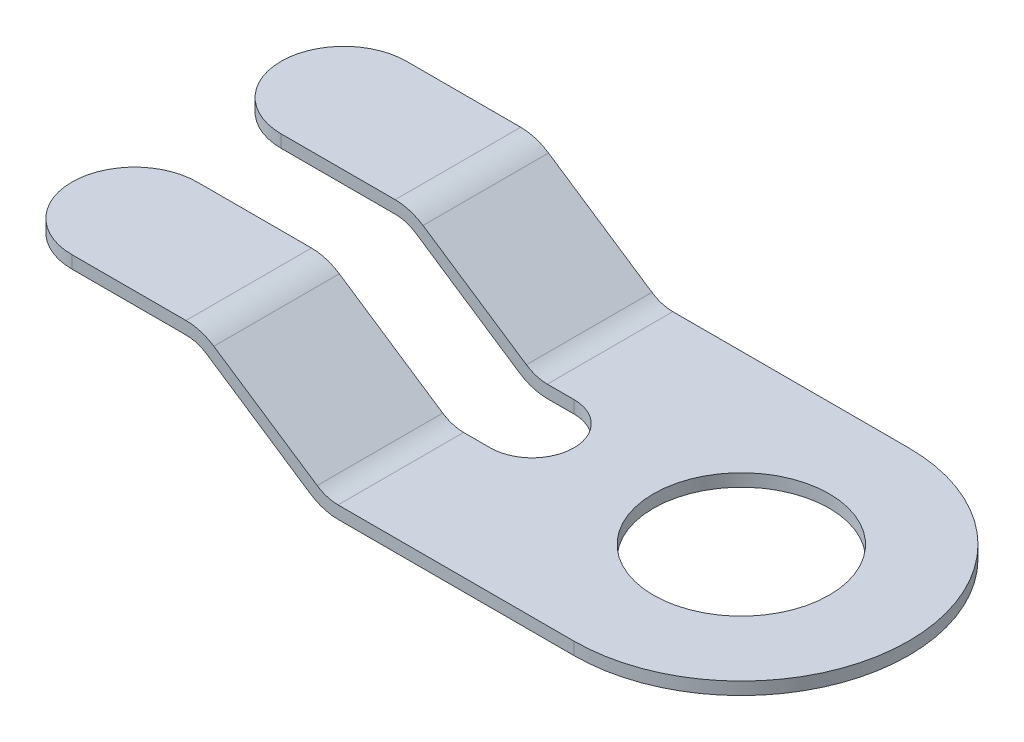
ISO-10303-21;
HEADER;
FILE_DESCRIPTION(('STEP AP214'),'2;1');
FILE_NAME('part.step','',(''),(''),'','','');
FILE_SCHEMA(('AUTOMOTIVE_DESIGN { 1 0 10303 214 1 1 1 1 }'));
ENDSEC;
DATA;
#1=APPLICATION_CONTEXT('core data for automotive mechanical design processes');
#2=APPLICATION_PROTOCOL_DEFINITION('international standard','automotive_design',2000,#1);
#3=PRODUCT_CONTEXT('',#1,'mechanical');
#4=PRODUCT('Part','Part','',(#3));
#5=PRODUCT_RELATED_PRODUCT_CATEGORY('part','',(#4));
#6=PRODUCT_DEFINITION_FORMATION('','',#4);
#7=PRODUCT_DEFINITION_CONTEXT('part definition',#1,'design');
#8=PRODUCT_DEFINITION('design','',#6,#7);
#9=PRODUCT_DEFINITION_SHAPE('','',#8);
#10=(LENGTH_UNIT() NAMED_UNIT(*) SI_UNIT(.MILLI.,.METRE.));
#11=(NAMED_UNIT(*) PLANE_ANGLE_UNIT() SI_UNIT($,.RADIAN.));
#12=(NAMED_UNIT(*) SI_UNIT($,.STERADIAN.) SOLID_ANGLE_UNIT());
#13=UNCERTAINTY_MEASURE_WITH_UNIT(LENGTH_MEASURE(1.E-05),#10,'distance_accuracy_value','');
#14=(GEOMETRIC_REPRESENTATION_CONTEXT(3) GLOBAL_UNCERTAINTY_ASSIGNED_CONTEXT((#13)) GLOBAL_UNIT_ASSIGNED_CONTEXT((#10,
#11,#12)) REPRESENTATION_CONTEXT('',''));
#15=CARTESIAN_POINT('',(0.,0.,0.));
#16=DIRECTION('',(0.,0.,1.));
#17=DIRECTION('',(1.,0.,0.));
#18=AXIS2_PLACEMENT_3D('',#15,#16,#17);
#19=CARTESIAN_POINT('',(1.27,0.0762,1.27));
#20=DIRECTION('',(0.,-1.,0.));
#21=DIRECTION('',(1.,0.,0.));
#22=AXIS2_PLACEMENT_3D('',#19,#20,#21);
#23=PLANE('',#22);
#24=CARTESIAN_POINT('',(-1.27,0.0761999999999994,0.));
#25=DIRECTION('',(0.,-1.,0.));
#26=DIRECTION('',(1.,0.,0.));
#27=AXIS2_PLACEMENT_3D('',#24,#25,#26);
#28=CIRCLE('',#27,0.254);
#29=CARTESIAN_POINT('',(-1.27,0.0761999999999994,0.254));
#30=VERTEX_POINT('',#29);
#31=CARTESIAN_POINT('',(-1.27,0.0761999999999998,-0.254));
#32=VERTEX_POINT('',#31);
#33=EDGE_CURVE('E393',#30,#32,#28,.F.);
#34=ORIENTED_EDGE('',*,*,#33,.F.);
#35=DIRECTION('',(-1.,0.,0.));
#36=VECTOR('',#35,1.);
#37=CARTESIAN_POINT('',(1.27,0.0762,0.254));
#38=LINE('',#37,#36);
#39=CARTESIAN_POINT('',(-1.43171398561929,0.0761999999999993,0.254));
#40=VERTEX_POINT('',#39);
#41=EDGE_CURVE('E216',#30,#40,#38,.T.);
#42=ORIENTED_EDGE('',*,*,#41,.T.);
#43=DIRECTION('',(0.,0.,-1.));
#44=VECTOR('',#43,1.);
#45=CARTESIAN_POINT('',(-1.43171398561929,0.0761999999999993,1.27));
#46=LINE('',#45,#44);
#47=CARTESIAN_POINT('',(-1.43171398561929,0.0761999999999993,1.016));
#48=VERTEX_POINT('',#47);
#49=EDGE_CURVE('E363',#48,#40,#46,.T.);
#50=ORIENTED_EDGE('',*,*,#49,.F.);
#51=DIRECTION('',(1.,0.,0.));
#52=VECTOR('',#51,1.);
#53=CARTESIAN_POINT('',(1.27,0.0762,1.016));
#54=LINE('',#53,#52);
#55=CARTESIAN_POINT('',(0.,0.0761999999999998,1.016));
#56=VERTEX_POINT('',#55);
#57=EDGE_CURVE('E271',#48,#56,#54,.T.);
#58=ORIENTED_EDGE('',*,*,#57,.T.);
#59=CARTESIAN_POINT('',(0.,0.0761999999999998,0.));
#60=DIRECTION('',(0.,-1.,0.));
#61=DIRECTION('',(1.,0.,0.));
#62=AXIS2_PLACEMENT_3D('',#59,#60,#61);
#63=CIRCLE('',#62,1.016);
#64=CARTESIAN_POINT('',(0.,0.0761999999999998,-1.016));
#65=VERTEX_POINT('',#64);
#66=EDGE_CURVE('E390',#56,#65,#63,.F.);
#67=ORIENTED_EDGE('',*,*,#66,.T.);
#68=DIRECTION('',(-1.,0.,0.));
#69=VECTOR('',#68,1.);
#70=CARTESIAN_POINT('',(1.27,0.0762,-1.016));
#71=LINE('',#70,#69);
#72=CARTESIAN_POINT('',(-1.43171398561929,0.0761999999999993,-1.016));
#73=VERTEX_POINT('',#72);
#74=EDGE_CURVE('E290',#65,#73,#71,.T.);
#75=ORIENTED_EDGE('',*,*,#74,.T.);
#76=CARTESIAN_POINT('',(-1.43171398561929,0.0761999999999993,-0.254));
#77=VERTEX_POINT('',#76);
#78=EDGE_CURVE('E360',#77,#73,#46,.T.);
#79=ORIENTED_EDGE('',*,*,#78,.F.);
#80=DIRECTION('',(1.,0.,0.));
#81=VECTOR('',#80,1.);
#82=CARTESIAN_POINT('',(1.27,0.0762,-0.254));
#83=LINE('',#82,#81);
#84=EDGE_CURVE('E310',#77,#32,#83,.T.);
#85=ORIENTED_EDGE('',*,*,#84,.T.);
#86=EDGE_LOOP('',(#34,#42,#50,#58,#67,#75,#79,#85));
#87=FACE_BOUND('',#86,.T.);
#88=CARTESIAN_POINT('',(0.,0.0761999999999998,0.));
#89=DIRECTION('',(0.,-1.,0.));
#90=DIRECTION('',(1.,0.,0.));
#91=AXIS2_PLACEMENT_3D('',#88,#89,#90);
#92=CIRCLE('',#91,0.533400000000003);
#93=CARTESIAN_POINT('',(0.533400000000003,0.0761999999999999,0.));
#94=VERTEX_POINT('',#93);
#95=EDGE_CURVE('E236',#94,#94,#92,.F.);
#96=ORIENTED_EDGE('',*,*,#95,.F.);
#97=EDGE_LOOP('',(#96));
#98=FACE_BOUND('',#97,.T.);
#99=ADVANCED_FACE('F50',(#87,#98),#23,.F.);
#100=CARTESIAN_POINT('',(1.27,0.,1.27));
#101=DIRECTION('',(0.,-1.,0.));
#102=DIRECTION('',(1.,0.,0.));
#103=AXIS2_PLACEMENT_3D('',#100,#101,#102);
#104=PLANE('',#103);
#105=DIRECTION('',(-1.,0.,0.));
#106=VECTOR('',#105,1.);
#107=CARTESIAN_POINT('',(-7.65649422242852,0.,0.254));
#108=LINE('',#107,#106);
#109=CARTESIAN_POINT('',(-1.27,0.,0.254));
#110=VERTEX_POINT('',#109);
#111=CARTESIAN_POINT('',(-1.43171398561929,0.,0.254));
#112=VERTEX_POINT('',#111);
#113=EDGE_CURVE('E213',#110,#112,#108,.T.);
#114=ORIENTED_EDGE('',*,*,#113,.F.);
#115=CARTESIAN_POINT('',(-1.27,0.,0.));
#116=DIRECTION('',(0.,1.,0.));
#117=DIRECTION('',(0.,0.,1.));
#118=AXIS2_PLACEMENT_3D('',#115,#116,#117);
#119=CIRCLE('',#118,0.254);
#120=CARTESIAN_POINT('',(-1.27,0.,-0.254));
#121=VERTEX_POINT('',#120);
#122=EDGE_CURVE('E223',#110,#121,#119,.T.);
#123=ORIENTED_EDGE('',*,*,#122,.T.);
#124=DIRECTION('',(1.,0.,0.));
#125=VECTOR('',#124,1.);
#126=CARTESIAN_POINT('',(-7.65649422242852,0.,-0.254));
#127=LINE('',#126,#125);
#128=CARTESIAN_POINT('',(-1.43171398561929,0.,-0.254));
#129=VERTEX_POINT('',#128);
#130=EDGE_CURVE('E229',#129,#121,#127,.T.);
#131=ORIENTED_EDGE('',*,*,#130,.F.);
#132=DIRECTION('',(0.,0.,-1.));
#133=VECTOR('',#132,1.);
#134=CARTESIAN_POINT('',(-1.43171398561929,0.,1.27));
#135=LINE('',#134,#133);
#136=CARTESIAN_POINT('',(-1.43171398561929,0.,-1.016));
#137=VERTEX_POINT('',#136);
#138=EDGE_CURVE('E364',#129,#137,#135,.T.);
#139=ORIENTED_EDGE('',*,*,#138,.T.);
#140=DIRECTION('',(-1.,0.,0.));
#141=VECTOR('',#140,1.);
#142=CARTESIAN_POINT('',(-7.65649422242852,0.,-1.016));
#143=LINE('',#142,#141);
#144=CARTESIAN_POINT('',(0.,0.,-1.016));
#145=VERTEX_POINT('',#144);
#146=EDGE_CURVE('E244',#145,#137,#143,.T.);
#147=ORIENTED_EDGE('',*,*,#146,.F.);
#148=CARTESIAN_POINT('',(0.,0.,0.));
#149=DIRECTION('',(0.,1.,0.));
#150=DIRECTION('',(0.,0.,1.));
#151=AXIS2_PLACEMENT_3D('',#148,#149,#150);
#152=CIRCLE('',#151,1.016);
#153=CARTESIAN_POINT('',(0.,0.,1.016));
#154=VERTEX_POINT('',#153);
#155=EDGE_CURVE('E246',#154,#145,#152,.T.);
#156=ORIENTED_EDGE('',*,*,#155,.F.);
#157=DIRECTION('',(1.,0.,0.));
#158=VECTOR('',#157,1.);
#159=CARTESIAN_POINT('',(-7.65649422242852,0.,1.016));
#160=LINE('',#159,#158);
#161=CARTESIAN_POINT('',(-1.43171398561929,0.,1.016));
#162=VERTEX_POINT('',#161);
#163=EDGE_CURVE('E249',#162,#154,#160,.T.);
#164=ORIENTED_EDGE('',*,*,#163,.F.);
#165=EDGE_CURVE('E235',#162,#112,#135,.T.);
#166=ORIENTED_EDGE('',*,*,#165,.T.);
#167=EDGE_LOOP('',(#114,#123,#131,#139,#147,#156,#164,#166));
#168=FACE_BOUND('',#167,.T.);
#169=CARTESIAN_POINT('',(0.,0.,0.));
#170=DIRECTION('',(0.,1.,0.));
#171=DIRECTION('',(0.,0.,1.));
#172=AXIS2_PLACEMENT_3D('',#169,#170,#171);
#173=CIRCLE('',#172,0.533400000000003);
#174=CARTESIAN_POINT('',(0.,0.,0.533400000000003));
#175=VERTEX_POINT('',#174);
#176=EDGE_CURVE('E239',#175,#175,#173,.T.);
#177=ORIENTED_EDGE('',*,*,#176,.T.);
#178=EDGE_LOOP('',(#177));
#179=FACE_BOUND('',#178,.T.);
#180=ADVANCED_FACE('F232',(#168,#179),#104,.T.);
#181=CARTESIAN_POINT('',(-2.35521451078553,0.2794,1.27));
#182=DIRECTION('',(0.,0.,-1.));
#183=DIRECTION('',(-1.,0.,0.));
#184=AXIS2_PLACEMENT_3D('',#181,#182,#183);
#185=CYLINDRICAL_SURFACE('',#184,0.3048);
#186=DIRECTION('',(0.,0.,-1.));
#187=VECTOR('',#186,1.);
#188=CARTESIAN_POINT('',(-2.35521451078553,0.5842,1.27));
#189=LINE('',#188,#187);
#190=CARTESIAN_POINT('',(-2.35521451078553,0.5842,-0.254));
#191=VERTEX_POINT('',#190);
#192=CARTESIAN_POINT('',(-2.35521451078553,0.5842,-1.016));
#193=VERTEX_POINT('',#192);
#194=EDGE_CURVE('E348',#191,#193,#189,.T.);
#195=ORIENTED_EDGE('',*,*,#194,.F.);
#196=CARTESIAN_POINT('',(-2.35521451078553,0.2794,-0.254));
#197=DIRECTION('',(0.,0.,-1.));
#198=DIRECTION('',(-1.,0.,0.));
#199=AXIS2_PLACEMENT_3D('',#196,#197,#198);
#200=CIRCLE('',#199,0.3048);
#201=CARTESIAN_POINT('',(-2.18614189097608,0.533008929714175,-0.254));
#202=VERTEX_POINT('',#201);
#203=EDGE_CURVE('E384',#191,#202,#200,.T.);
#204=ORIENTED_EDGE('',*,*,#203,.T.);
#205=DIRECTION('',(0.,0.,-1.));
#206=VECTOR('',#205,1.);
#207=CARTESIAN_POINT('',(-2.18614189097608,0.533008929714175,1.27));
#208=LINE('',#207,#206);
#209=CARTESIAN_POINT('',(-2.18614189097608,0.533008929714175,-1.016));
#210=VERTEX_POINT('',#209);
#211=EDGE_CURVE('E352',#202,#210,#208,.T.);
#212=ORIENTED_EDGE('',*,*,#211,.T.);
#213=CARTESIAN_POINT('',(-2.35521451078553,0.2794,-1.016));
#214=DIRECTION('',(0.,0.,1.));
#215=DIRECTION('',(1.,0.,0.));
#216=AXIS2_PLACEMENT_3D('',#213,#214,#215);
#217=CIRCLE('',#216,0.3048);
#218=EDGE_CURVE('E381',#210,#193,#217,.T.);
#219=ORIENTED_EDGE('',*,*,#218,.T.);
#220=EDGE_LOOP('',(#195,#204,#212,#219));
#221=FACE_BOUND('',#220,.T.);
#222=ADVANCED_FACE('F472',(#221),#185,.T.);
#223=CARTESIAN_POINT('',(-1.48173184504764,0.0634022324285433,1.27));
#224=DIRECTION('',(-0.554700196225229,-0.832050294337844,0.));
#225=DIRECTION('',(0.832050294337844,-0.554700196225229,0.));
#226=AXIS2_PLACEMENT_3D('',#223,#224,#225);
#227=PLANE('',#226);
#228=ORIENTED_EDGE('',*,*,#211,.F.);
#229=DIRECTION('',(0.832050294337844,-0.554700196225229,0.));
#230=VECTOR('',#229,1.);
#231=CARTESIAN_POINT('',(-1.48173184504764,0.0634022324285434,-0.254));
#232=LINE('',#231,#230);
#233=CARTESIAN_POINT('',(-1.55851845047637,0.114593302714368,-0.254));
#234=VERTEX_POINT('',#233);
#235=EDGE_CURVE('E304',#202,#234,#232,.T.);
#236=ORIENTED_EDGE('',*,*,#235,.T.);
#237=DIRECTION('',(0.,0.,-1.));
#238=VECTOR('',#237,1.);
#239=CARTESIAN_POINT('',(-1.55851845047637,0.114593302714368,1.27));
#240=LINE('',#239,#238);
#241=CARTESIAN_POINT('',(-1.55851845047637,0.114593302714368,-1.016));
#242=VERTEX_POINT('',#241);
#243=EDGE_CURVE('E356',#234,#242,#240,.T.);
#244=ORIENTED_EDGE('',*,*,#243,.T.);
#245=DIRECTION('',(-0.832050294337844,0.554700196225229,0.));
#246=VECTOR('',#245,1.);
#247=CARTESIAN_POINT('',(-1.48173184504764,0.0634022324285433,-1.016));
#248=LINE('',#247,#246);
#249=EDGE_CURVE('E284',#242,#210,#248,.T.);
#250=ORIENTED_EDGE('',*,*,#249,.T.);
#251=EDGE_LOOP('',(#228,#236,#244,#250));
#252=FACE_BOUND('',#251,.T.);
#253=ADVANCED_FACE('F475',(#252),#227,.F.);
#254=CARTESIAN_POINT('',(-1.43171398561929,0.304799999999999,1.27));
#255=DIRECTION('',(0.,0.,-1.));
#256=DIRECTION('',(-1.,0.,0.));
#257=AXIS2_PLACEMENT_3D('',#254,#255,#256);
#258=CYLINDRICAL_SURFACE('',#257,0.2286);
#259=ORIENTED_EDGE('',*,*,#243,.F.);
#260=CARTESIAN_POINT('',(-1.43171398561929,0.304799999999999,-0.254));
#261=DIRECTION('',(0.,0.,-1.));
#262=DIRECTION('',(-1.,0.,0.));
#263=AXIS2_PLACEMENT_3D('',#260,#261,#262);
#264=CIRCLE('',#263,0.2286);
#265=EDGE_CURVE('E307',#234,#77,#264,.F.);
#266=ORIENTED_EDGE('',*,*,#265,.T.);
#267=ORIENTED_EDGE('',*,*,#78,.T.);
#268=CARTESIAN_POINT('',(-1.43171398561929,0.304799999999999,-1.016));
#269=DIRECTION('',(0.,0.,1.));
#270=DIRECTION('',(1.,0.,0.));
#271=AXIS2_PLACEMENT_3D('',#268,#269,#270);
#272=CIRCLE('',#271,0.2286);
#273=EDGE_CURVE('E287',#73,#242,#272,.F.);
#274=ORIENTED_EDGE('',*,*,#273,.T.);
#275=EDGE_LOOP('',(#259,#266,#267,#274));
#276=FACE_BOUND('',#275,.T.);
#277=ADVANCED_FACE('F478',(#276),#258,.F.);
#278=CARTESIAN_POINT('',(-2.18614189097608,0.533008929714175,1.016));
#279=VERTEX_POINT('',#278);
#280=CARTESIAN_POINT('',(-2.18614189097608,0.533008929714175,0.254));
#281=VERTEX_POINT('',#280);
#282=EDGE_CURVE('E355',#279,#281,#208,.T.);
#283=ORIENTED_EDGE('',*,*,#282,.T.);
#284=CARTESIAN_POINT('',(-2.35521451078553,0.2794,0.254));
#285=DIRECTION('',(0.,0.,1.));
#286=DIRECTION('',(1.,0.,0.));
#287=AXIS2_PLACEMENT_3D('',#284,#285,#286);
#288=CIRCLE('',#287,0.3048);
#289=CARTESIAN_POINT('',(-2.35521451078553,0.5842,0.254));
#290=VERTEX_POINT('',#289);
#291=EDGE_CURVE('E387',#281,#290,#288,.T.);
#292=ORIENTED_EDGE('',*,*,#291,.T.);
#293=CARTESIAN_POINT('',(-2.35521451078553,0.5842,1.016));
#294=VERTEX_POINT('',#293);
#295=EDGE_CURVE('E351',#294,#290,#189,.T.);
#296=ORIENTED_EDGE('',*,*,#295,.F.);
#297=CARTESIAN_POINT('',(-2.35521451078553,0.2794,1.016));
#298=DIRECTION('',(0.,0.,-1.));
#299=DIRECTION('',(-1.,0.,0.));
#300=AXIS2_PLACEMENT_3D('',#297,#298,#299);
#301=CIRCLE('',#300,0.3048);
#302=EDGE_CURVE('E379',#294,#279,#301,.T.);
#303=ORIENTED_EDGE('',*,*,#302,.T.);
#304=EDGE_LOOP('',(#283,#292,#296,#303));
#305=FACE_BOUND('',#304,.T.);
#306=ADVANCED_FACE('F425',(#305),#185,.T.);
#307=CARTESIAN_POINT('',(-1.55851845047637,0.114593302714368,1.016));
#308=VERTEX_POINT('',#307);
#309=CARTESIAN_POINT('',(-1.55851845047637,0.114593302714368,0.254));
#310=VERTEX_POINT('',#309);
#311=EDGE_CURVE('E359',#308,#310,#240,.T.);
#312=ORIENTED_EDGE('',*,*,#311,.T.);
#313=DIRECTION('',(-0.832050294337844,0.554700196225229,0.));
#314=VECTOR('',#313,1.);
#315=CARTESIAN_POINT('',(-1.48173184504764,0.0634022324285433,0.254));
#316=LINE('',#315,#314);
#317=EDGE_CURVE('E324',#310,#281,#316,.T.);
#318=ORIENTED_EDGE('',*,*,#317,.T.);
#319=ORIENTED_EDGE('',*,*,#282,.F.);
#320=DIRECTION('',(0.832050294337844,-0.554700196225229,0.));
#321=VECTOR('',#320,1.);
#322=CARTESIAN_POINT('',(-1.48173184504764,0.0634022324285433,1.016));
#323=LINE('',#322,#321);
#324=EDGE_CURVE('E72',#279,#308,#323,.T.);
#325=ORIENTED_EDGE('',*,*,#324,.T.);
#326=EDGE_LOOP('',(#312,#318,#319,#325));
#327=FACE_BOUND('',#326,.T.);
#328=ADVANCED_FACE('F429',(#327),#227,.F.);
#329=ORIENTED_EDGE('',*,*,#49,.T.);
#330=CARTESIAN_POINT('',(-1.43171398561929,0.304799999999999,0.254));
#331=DIRECTION('',(0.,0.,1.));
#332=DIRECTION('',(1.,0.,0.));
#333=AXIS2_PLACEMENT_3D('',#330,#331,#332);
#334=CIRCLE('',#333,0.2286);
#335=EDGE_CURVE('E327',#40,#310,#334,.F.);
#336=ORIENTED_EDGE('',*,*,#335,.T.);
#337=ORIENTED_EDGE('',*,*,#311,.F.);
#338=CARTESIAN_POINT('',(-1.43171398561929,0.304799999999999,1.016));
#339=DIRECTION('',(0.,0.,-1.));
#340=DIRECTION('',(-1.,0.,0.));
#341=AXIS2_PLACEMENT_3D('',#338,#339,#340);
#342=CIRCLE('',#341,0.2286);
#343=EDGE_CURVE('E268',#308,#48,#342,.F.);
#344=ORIENTED_EDGE('',*,*,#343,.T.);
#345=EDGE_LOOP('',(#329,#336,#337,#344));
#346=FACE_BOUND('',#345,.T.);
#347=ADVANCED_FACE('F433',(#346),#258,.F.);
#348=CARTESIAN_POINT('',(-2.286,0.5842,1.27));
#349=DIRECTION('',(0.,-1.,0.));
#350=DIRECTION('',(1.,0.,0.));
#351=AXIS2_PLACEMENT_3D('',#348,#349,#350);
#352=PLANE('',#351);
#353=ORIENTED_EDGE('',*,*,#295,.T.);
#354=DIRECTION('',(-1.,0.,0.));
#355=VECTOR('',#354,1.);
#356=CARTESIAN_POINT('',(-2.286,0.5842,0.254));
#357=LINE('',#356,#355);
#358=CARTESIAN_POINT('',(-3.048,0.5842,0.254));
#359=VERTEX_POINT('',#358);
#360=EDGE_CURVE('E331',#290,#359,#357,.T.);
#361=ORIENTED_EDGE('',*,*,#360,.T.);
#362=CARTESIAN_POINT('',(-3.048,0.5842,0.635));
#363=DIRECTION('',(0.,-1.,0.));
#364=DIRECTION('',(1.,0.,0.));
#365=AXIS2_PLACEMENT_3D('',#362,#363,#364);
#366=CIRCLE('',#365,0.381);
#367=CARTESIAN_POINT('',(-3.048,0.5842,1.016));
#368=VERTEX_POINT('',#367);
#369=EDGE_CURVE('E345',#359,#368,#366,.F.);
#370=ORIENTED_EDGE('',*,*,#369,.T.);
#371=DIRECTION('',(1.,0.,0.));
#372=VECTOR('',#371,1.);
#373=CARTESIAN_POINT('',(-2.286,0.5842,1.016));
#374=LINE('',#373,#372);
#375=EDGE_CURVE('E274',#368,#294,#374,.T.);
#376=ORIENTED_EDGE('',*,*,#375,.T.);
#377=EDGE_LOOP('',(#353,#361,#370,#376));
#378=FACE_BOUND('',#377,.T.);
#379=ADVANCED_FACE('F52',(#378),#352,.F.);
#380=CARTESIAN_POINT('',(-3.048,0.5842,-0.635));
#381=DIRECTION('',(0.,-1.,0.));
#382=DIRECTION('',(1.,0.,0.));
#383=AXIS2_PLACEMENT_3D('',#380,#381,#382);
#384=CIRCLE('',#383,0.381);
#385=CARTESIAN_POINT('',(-3.048,0.5842,-1.016));
#386=VERTEX_POINT('',#385);
#387=CARTESIAN_POINT('',(-3.048,0.5842,-0.254));
#388=VERTEX_POINT('',#387);
#389=EDGE_CURVE('E342',#386,#388,#384,.F.);
#390=ORIENTED_EDGE('',*,*,#389,.T.);
#391=DIRECTION('',(1.,0.,0.));
#392=VECTOR('',#391,1.);
#393=CARTESIAN_POINT('',(-2.286,0.5842,-0.254));
#394=LINE('',#393,#392);
#395=EDGE_CURVE('E313',#388,#191,#394,.T.);
#396=ORIENTED_EDGE('',*,*,#395,.T.);
#397=ORIENTED_EDGE('',*,*,#194,.T.);
#398=DIRECTION('',(-1.,0.,0.));
#399=VECTOR('',#398,1.);
#400=CARTESIAN_POINT('',(-2.286,0.5842,-1.016));
#401=LINE('',#400,#399);
#402=EDGE_CURVE('E293',#193,#386,#401,.T.);
#403=ORIENTED_EDGE('',*,*,#402,.T.);
#404=EDGE_LOOP('',(#390,#396,#397,#403));
#405=FACE_BOUND('',#404,.T.);
#406=ADVANCED_FACE('F470',(#405),#352,.F.);
#407=CARTESIAN_POINT('',(-3.048,2.54,0.635));
#408=DIRECTION('',(0.,-1.,0.));
#409=DIRECTION('',(0.,0.,-1.));
#410=AXIS2_PLACEMENT_3D('',#407,#408,#409);
#411=CYLINDRICAL_SURFACE('',#410,0.381);
#412=DIRECTION('',(0.,-1.,0.));
#413=VECTOR('',#412,1.);
#414=CARTESIAN_POINT('',(-3.048,2.54,0.254));
#415=LINE('',#414,#413);
#416=CARTESIAN_POINT('',(-3.048,0.507999999999999,0.254));
#417=VERTEX_POINT('',#416);
#418=EDGE_CURVE('E219',#359,#417,#415,.T.);
#419=ORIENTED_EDGE('',*,*,#418,.T.);
#420=CARTESIAN_POINT('',(-3.048,0.508,0.635));
#421=DIRECTION('',(0.,-1.,0.));
#422=DIRECTION('',(1.,0.,0.));
#423=AXIS2_PLACEMENT_3D('',#420,#421,#422);
#424=CIRCLE('',#423,0.381);
#425=CARTESIAN_POINT('',(-3.048,0.507999999999999,1.016));
#426=VERTEX_POINT('',#425);
#427=EDGE_CURVE('E58',#417,#426,#424,.F.);
#428=ORIENTED_EDGE('',*,*,#427,.T.);
#429=DIRECTION('',(0.,-1.,0.));
#430=VECTOR('',#429,1.);
#431=CARTESIAN_POINT('',(-3.048,2.54,1.016));
#432=LINE('',#431,#430);
#433=EDGE_CURVE('E251',#368,#426,#432,.T.);
#434=ORIENTED_EDGE('',*,*,#433,.F.);
#435=ORIENTED_EDGE('',*,*,#369,.F.);
#436=EDGE_LOOP('',(#419,#428,#434,#435));
#437=FACE_BOUND('',#436,.T.);
#438=ADVANCED_FACE('F397',(#437),#411,.T.);
#439=CARTESIAN_POINT('',(-3.048,2.54,-0.635));
#440=DIRECTION('',(0.,-1.,0.));
#441=DIRECTION('',(0.,0.,-1.));
#442=AXIS2_PLACEMENT_3D('',#439,#440,#441);
#443=CYLINDRICAL_SURFACE('',#442,0.381);
#444=DIRECTION('',(0.,-1.,0.));
#445=VECTOR('',#444,1.);
#446=CARTESIAN_POINT('',(-3.048,2.54,-1.016));
#447=LINE('',#446,#445);
#448=CARTESIAN_POINT('',(-3.048,0.507999999999999,-1.016));
#449=VERTEX_POINT('',#448);
#450=EDGE_CURVE('E258',#386,#449,#447,.T.);
#451=ORIENTED_EDGE('',*,*,#450,.T.);
#452=CARTESIAN_POINT('',(-3.048,0.508,-0.635));
#453=DIRECTION('',(0.,-1.,0.));
#454=DIRECTION('',(1.,0.,0.));
#455=AXIS2_PLACEMENT_3D('',#452,#453,#454);
#456=CIRCLE('',#455,0.381);
#457=CARTESIAN_POINT('',(-3.048,0.508,-0.254));
#458=VERTEX_POINT('',#457);
#459=EDGE_CURVE('E12',#449,#458,#456,.F.);
#460=ORIENTED_EDGE('',*,*,#459,.T.);
#461=DIRECTION('',(0.,-1.,0.));
#462=VECTOR('',#461,1.);
#463=CARTESIAN_POINT('',(-3.048,2.54,-0.254));
#464=LINE('',#463,#462);
#465=EDGE_CURVE('E261',#388,#458,#464,.T.);
#466=ORIENTED_EDGE('',*,*,#465,.F.);
#467=ORIENTED_EDGE('',*,*,#389,.F.);
#468=EDGE_LOOP('',(#451,#460,#466,#467));
#469=FACE_BOUND('',#468,.T.);
#470=ADVANCED_FACE('F467',(#469),#443,.T.);
#471=CARTESIAN_POINT('',(-1.27,2.54,0.));
#472=DIRECTION('',(0.,-1.,0.));
#473=DIRECTION('',(0.,0.,-1.));
#474=AXIS2_PLACEMENT_3D('',#471,#472,#473);
#475=CYLINDRICAL_SURFACE('',#474,0.254);
#476=ORIENTED_EDGE('',*,*,#33,.T.);
#477=DIRECTION('',(0.,-1.,0.));
#478=VECTOR('',#477,1.);
#479=CARTESIAN_POINT('',(-1.27,2.54,-0.254));
#480=LINE('',#479,#478);
#481=EDGE_CURVE('E220',#32,#121,#480,.T.);
#482=ORIENTED_EDGE('',*,*,#481,.T.);
#483=ORIENTED_EDGE('',*,*,#122,.F.);
#484=DIRECTION('',(0.,-1.,0.));
#485=VECTOR('',#484,1.);
#486=CARTESIAN_POINT('',(-1.27,2.54,0.254));
#487=LINE('',#486,#485);
#488=EDGE_CURVE('E209',#30,#110,#487,.T.);
#489=ORIENTED_EDGE('',*,*,#488,.F.);
#490=EDGE_LOOP('',(#476,#482,#483,#489));
#491=FACE_BOUND('',#490,.T.);
#492=ADVANCED_FACE('F224',(#491),#475,.F.);
#493=CARTESIAN_POINT('',(0.,2.54,0.));
#494=DIRECTION('',(0.,-1.,0.));
#495=DIRECTION('',(0.,0.,-1.));
#496=AXIS2_PLACEMENT_3D('',#493,#494,#495);
#497=CYLINDRICAL_SURFACE('',#496,1.016);
#498=DIRECTION('',(0.,-1.,0.));
#499=VECTOR('',#498,1.);
#500=CARTESIAN_POINT('',(0.,2.54,1.016));
#501=LINE('',#500,#499);
#502=EDGE_CURVE('E254',#56,#154,#501,.T.);
#503=ORIENTED_EDGE('',*,*,#502,.T.);
#504=ORIENTED_EDGE('',*,*,#155,.T.);
#505=DIRECTION('',(0.,-1.,0.));
#506=VECTOR('',#505,1.);
#507=CARTESIAN_POINT('',(0.,2.54,-1.016));
#508=LINE('',#507,#506);
#509=EDGE_CURVE('E256',#65,#145,#508,.T.);
#510=ORIENTED_EDGE('',*,*,#509,.F.);
#511=ORIENTED_EDGE('',*,*,#66,.F.);
#512=EDGE_LOOP('',(#503,#504,#510,#511));
#513=FACE_BOUND('',#512,.T.);
#514=ADVANCED_FACE('F482',(#513),#497,.T.);
#515=CARTESIAN_POINT('',(-7.65649422242852,2.54,0.254));
#516=DIRECTION('',(0.,0.,1.));
#517=DIRECTION('',(1.,0.,0.));
#518=AXIS2_PLACEMENT_3D('',#515,#516,#517);
#519=PLANE('',#518);
#520=DIRECTION('',(-1.,0.,0.));
#521=VECTOR('',#520,1.);
#522=CARTESIAN_POINT('',(-2.286,0.508,0.254));
#523=LINE('',#522,#521);
#524=CARTESIAN_POINT('',(-2.35521451078553,0.508,0.254));
#525=VERTEX_POINT('',#524);
#526=EDGE_CURVE('E340',#525,#417,#523,.T.);
#527=ORIENTED_EDGE('',*,*,#526,.T.);
#528=ORIENTED_EDGE('',*,*,#418,.F.);
#529=ORIENTED_EDGE('',*,*,#360,.F.);
#530=ORIENTED_EDGE('',*,*,#291,.F.);
#531=ORIENTED_EDGE('',*,*,#317,.F.);
#532=ORIENTED_EDGE('',*,*,#335,.F.);
#533=ORIENTED_EDGE('',*,*,#41,.F.);
#534=ORIENTED_EDGE('',*,*,#488,.T.);
#535=ORIENTED_EDGE('',*,*,#113,.T.);
#536=CARTESIAN_POINT('',(-1.43171398561929,0.304799999999999,0.254));
#537=DIRECTION('',(0.,0.,1.));
#538=DIRECTION('',(1.,0.,0.));
#539=AXIS2_PLACEMENT_3D('',#536,#537,#538);
#540=CIRCLE('',#539,0.3048);
#541=CARTESIAN_POINT('',(-1.60078660542874,0.0511910702858245,0.254));
#542=VERTEX_POINT('',#541);
#543=EDGE_CURVE('E334',#112,#542,#540,.F.);
#544=ORIENTED_EDGE('',*,*,#543,.T.);
#545=DIRECTION('',(-0.832050294337844,0.554700196225229,0.));
#546=VECTOR('',#545,1.);
#547=CARTESIAN_POINT('',(-1.524,0.,0.254));
#548=LINE('',#547,#546);
#549=CARTESIAN_POINT('',(-2.22841004592845,0.469606697285631,0.254));
#550=VERTEX_POINT('',#549);
#551=EDGE_CURVE('E336',#542,#550,#548,.T.);
#552=ORIENTED_EDGE('',*,*,#551,.T.);
#553=CARTESIAN_POINT('',(-2.35521451078553,0.2794,0.254));
#554=DIRECTION('',(0.,0.,1.));
#555=DIRECTION('',(1.,0.,0.));
#556=AXIS2_PLACEMENT_3D('',#553,#554,#555);
#557=CIRCLE('',#556,0.2286);
#558=EDGE_CURVE('E338',#550,#525,#557,.T.);
#559=ORIENTED_EDGE('',*,*,#558,.T.);
#560=EDGE_LOOP('',(#527,#528,#529,#530,#531,#532,#533,#534,#535,#544,#552,#559));
#561=FACE_BOUND('',#560,.T.);
#562=ADVANCED_FACE('F211',(#561),#519,.F.);
#563=CARTESIAN_POINT('',(-7.65649422242852,2.54,-0.254));
#564=DIRECTION('',(0.,0.,-1.));
#565=DIRECTION('',(-1.,0.,0.));
#566=AXIS2_PLACEMENT_3D('',#563,#564,#565);
#567=PLANE('',#566);
#568=DIRECTION('',(1.,0.,0.));
#569=VECTOR('',#568,1.);
#570=CARTESIAN_POINT('',(-2.286,0.508,-0.254));
#571=LINE('',#570,#569);
#572=CARTESIAN_POINT('',(-2.35521451078553,0.508,-0.254));
#573=VERTEX_POINT('',#572);
#574=EDGE_CURVE('E322',#458,#573,#571,.T.);
#575=ORIENTED_EDGE('',*,*,#574,.T.);
#576=CARTESIAN_POINT('',(-2.35521451078553,0.2794,-0.254));
#577=DIRECTION('',(0.,0.,-1.));
#578=DIRECTION('',(-1.,0.,0.));
#579=AXIS2_PLACEMENT_3D('',#576,#577,#578);
#580=CIRCLE('',#579,0.2286);
#581=CARTESIAN_POINT('',(-2.22841004592845,0.469606697285631,-0.254));
#582=VERTEX_POINT('',#581);
#583=EDGE_CURVE('E320',#573,#582,#580,.T.);
#584=ORIENTED_EDGE('',*,*,#583,.T.);
#585=DIRECTION('',(0.832050294337844,-0.554700196225229,0.));
#586=VECTOR('',#585,1.);
#587=CARTESIAN_POINT('',(-1.524,0.,-0.254));
#588=LINE('',#587,#586);
#589=CARTESIAN_POINT('',(-1.60078660542874,0.0511910702858245,-0.254));
#590=VERTEX_POINT('',#589);
#591=EDGE_CURVE('E318',#582,#590,#588,.T.);
#592=ORIENTED_EDGE('',*,*,#591,.T.);
#593=CARTESIAN_POINT('',(-1.43171398561929,0.304799999999999,-0.254));
#594=DIRECTION('',(0.,0.,-1.));
#595=DIRECTION('',(-1.,0.,0.));
#596=AXIS2_PLACEMENT_3D('',#593,#594,#595);
#597=CIRCLE('',#596,0.3048);
#598=EDGE_CURVE('E316',#590,#129,#597,.F.);
#599=ORIENTED_EDGE('',*,*,#598,.T.);
#600=ORIENTED_EDGE('',*,*,#130,.T.);
#601=ORIENTED_EDGE('',*,*,#481,.F.);
#602=ORIENTED_EDGE('',*,*,#84,.F.);
#603=ORIENTED_EDGE('',*,*,#265,.F.);
#604=ORIENTED_EDGE('',*,*,#235,.F.);
#605=ORIENTED_EDGE('',*,*,#203,.F.);
#606=ORIENTED_EDGE('',*,*,#395,.F.);
#607=ORIENTED_EDGE('',*,*,#465,.T.);
#608=EDGE_LOOP('',(#575,#584,#592,#599,#600,#601,#602,#603,#604,#605,#606,#607));
#609=FACE_BOUND('',#608,.T.);
#610=ADVANCED_FACE('F439',(#609),#567,.F.);
#611=CARTESIAN_POINT('',(-7.65649422242852,2.54,-1.016));
#612=DIRECTION('',(0.,0.,1.));
#613=DIRECTION('',(1.,0.,0.));
#614=AXIS2_PLACEMENT_3D('',#611,#612,#613);
#615=PLANE('',#614);
#616=DIRECTION('',(-1.,0.,0.));
#617=VECTOR('',#616,1.);
#618=CARTESIAN_POINT('',(-2.286,0.508,-1.016));
#619=LINE('',#618,#617);
#620=CARTESIAN_POINT('',(-2.35521451078553,0.508,-1.016));
#621=VERTEX_POINT('',#620);
#622=EDGE_CURVE('E302',#621,#449,#619,.T.);
#623=ORIENTED_EDGE('',*,*,#622,.T.);
#624=ORIENTED_EDGE('',*,*,#450,.F.);
#625=ORIENTED_EDGE('',*,*,#402,.F.);
#626=ORIENTED_EDGE('',*,*,#218,.F.);
#627=ORIENTED_EDGE('',*,*,#249,.F.);
#628=ORIENTED_EDGE('',*,*,#273,.F.);
#629=ORIENTED_EDGE('',*,*,#74,.F.);
#630=ORIENTED_EDGE('',*,*,#509,.T.);
#631=ORIENTED_EDGE('',*,*,#146,.T.);
#632=CARTESIAN_POINT('',(-1.43171398561929,0.304799999999999,-1.016));
#633=DIRECTION('',(0.,0.,1.));
#634=DIRECTION('',(1.,0.,0.));
#635=AXIS2_PLACEMENT_3D('',#632,#633,#634);
#636=CIRCLE('',#635,0.3048);
#637=CARTESIAN_POINT('',(-1.60078660542874,0.0511910702858245,-1.016));
#638=VERTEX_POINT('',#637);
#639=EDGE_CURVE('E296',#137,#638,#636,.F.);
#640=ORIENTED_EDGE('',*,*,#639,.T.);
#641=DIRECTION('',(-0.832050294337844,0.554700196225229,0.));
#642=VECTOR('',#641,1.);
#643=CARTESIAN_POINT('',(-1.524,0.,-1.016));
#644=LINE('',#643,#642);
#645=CARTESIAN_POINT('',(-2.22841004592845,0.469606697285631,-1.016));
#646=VERTEX_POINT('',#645);
#647=EDGE_CURVE('E298',#638,#646,#644,.T.);
#648=ORIENTED_EDGE('',*,*,#647,.T.);
#649=CARTESIAN_POINT('',(-2.35521451078553,0.2794,-1.016));
#650=DIRECTION('',(0.,0.,1.));
#651=DIRECTION('',(1.,0.,0.));
#652=AXIS2_PLACEMENT_3D('',#649,#650,#651);
#653=CIRCLE('',#652,0.2286);
#654=EDGE_CURVE('E300',#646,#621,#653,.T.);
#655=ORIENTED_EDGE('',*,*,#654,.T.);
#656=EDGE_LOOP('',(#623,#624,#625,#626,#627,#628,#629,#630,#631,#640,#648,#655));
#657=FACE_BOUND('',#656,.T.);
#658=ADVANCED_FACE('F449',(#657),#615,.F.);
#659=CARTESIAN_POINT('',(-7.65649422242852,2.54,1.016));
#660=DIRECTION('',(0.,0.,-1.));
#661=DIRECTION('',(-1.,0.,0.));
#662=AXIS2_PLACEMENT_3D('',#659,#660,#661);
#663=PLANE('',#662);
#664=DIRECTION('',(1.,0.,0.));
#665=VECTOR('',#664,1.);
#666=CARTESIAN_POINT('',(-2.286,0.508,1.016));
#667=LINE('',#666,#665);
#668=CARTESIAN_POINT('',(-2.35521451078553,0.508,1.016));
#669=VERTEX_POINT('',#668);
#670=EDGE_CURVE('E282',#426,#669,#667,.T.);
#671=ORIENTED_EDGE('',*,*,#670,.T.);
#672=CARTESIAN_POINT('',(-2.35521451078553,0.2794,1.016));
#673=DIRECTION('',(0.,0.,-1.));
#674=DIRECTION('',(-1.,0.,0.));
#675=AXIS2_PLACEMENT_3D('',#672,#673,#674);
#676=CIRCLE('',#675,0.2286);
#677=CARTESIAN_POINT('',(-2.22841004592845,0.469606697285631,1.016));
#678=VERTEX_POINT('',#677);
#679=EDGE_CURVE('E280',#669,#678,#676,.T.);
#680=ORIENTED_EDGE('',*,*,#679,.T.);
#681=DIRECTION('',(0.832050294337844,-0.554700196225229,0.));
#682=VECTOR('',#681,1.);
#683=CARTESIAN_POINT('',(-1.524,0.,1.016));
#684=LINE('',#683,#682);
#685=CARTESIAN_POINT('',(-1.60078660542874,0.0511910702858245,1.016));
#686=VERTEX_POINT('',#685);
#687=EDGE_CURVE('E278',#678,#686,#684,.T.);
#688=ORIENTED_EDGE('',*,*,#687,.T.);
#689=CARTESIAN_POINT('',(-1.43171398561929,0.304799999999999,1.016));
#690=DIRECTION('',(0.,0.,-1.));
#691=DIRECTION('',(-1.,0.,0.));
#692=AXIS2_PLACEMENT_3D('',#689,#690,#691);
#693=CIRCLE('',#692,0.3048);
#694=EDGE_CURVE('E65',#686,#162,#693,.F.);
#695=ORIENTED_EDGE('',*,*,#694,.T.);
#696=ORIENTED_EDGE('',*,*,#163,.T.);
#697=ORIENTED_EDGE('',*,*,#502,.F.);
#698=ORIENTED_EDGE('',*,*,#57,.F.);
#699=ORIENTED_EDGE('',*,*,#343,.F.);
#700=ORIENTED_EDGE('',*,*,#324,.F.);
#701=ORIENTED_EDGE('',*,*,#302,.F.);
#702=ORIENTED_EDGE('',*,*,#375,.F.);
#703=ORIENTED_EDGE('',*,*,#433,.T.);
#704=EDGE_LOOP('',(#671,#680,#688,#695,#696,#697,#698,#699,#700,#701,#702,#703));
#705=FACE_BOUND('',#704,.T.);
#706=ADVANCED_FACE('F402',(#705),#663,.F.);
#707=CARTESIAN_POINT('',(-2.286,0.508,1.27));
#708=DIRECTION('',(0.,-1.,0.));
#709=DIRECTION('',(1.,0.,0.));
#710=AXIS2_PLACEMENT_3D('',#707,#708,#709);
#711=PLANE('',#710);
#712=ORIENTED_EDGE('',*,*,#574,.F.);
#713=ORIENTED_EDGE('',*,*,#459,.F.);
#714=ORIENTED_EDGE('',*,*,#622,.F.);
#715=DIRECTION('',(0.,0.,-1.));
#716=VECTOR('',#715,1.);
#717=CARTESIAN_POINT('',(-2.35521451078553,0.508,1.27));
#718=LINE('',#717,#716);
#719=EDGE_CURVE('E375',#573,#621,#718,.T.);
#720=ORIENTED_EDGE('',*,*,#719,.F.);
#721=EDGE_LOOP('',(#712,#713,#714,#720));
#722=FACE_BOUND('',#721,.T.);
#723=ADVANCED_FACE('F464',(#722),#711,.T.);
#724=CARTESIAN_POINT('',(-2.35521451078553,0.2794,1.27));
#725=DIRECTION('',(0.,0.,-1.));
#726=DIRECTION('',(-1.,0.,0.));
#727=AXIS2_PLACEMENT_3D('',#724,#725,#726);
#728=CYLINDRICAL_SURFACE('',#727,0.2286);
#729=ORIENTED_EDGE('',*,*,#558,.F.);
#730=DIRECTION('',(0.,0.,-1.));
#731=VECTOR('',#730,1.);
#732=CARTESIAN_POINT('',(-2.22841004592845,0.469606697285631,1.27));
#733=LINE('',#732,#731);
#734=EDGE_CURVE('E374',#678,#550,#733,.T.);
#735=ORIENTED_EDGE('',*,*,#734,.F.);
#736=ORIENTED_EDGE('',*,*,#679,.F.);
#737=EDGE_CURVE('E378',#669,#525,#718,.T.);
#738=ORIENTED_EDGE('',*,*,#737,.T.);
#739=EDGE_LOOP('',(#729,#735,#736,#738));
#740=FACE_BOUND('',#739,.T.);
#741=ADVANCED_FACE('F409',(#740),#728,.F.);
#742=CARTESIAN_POINT('',(-1.524,0.,1.27));
#743=DIRECTION('',(-0.554700196225229,-0.832050294337844,0.));
#744=DIRECTION('',(0.832050294337844,-0.554700196225229,0.));
#745=AXIS2_PLACEMENT_3D('',#742,#743,#744);
#746=PLANE('',#745);
#747=ORIENTED_EDGE('',*,*,#551,.F.);
#748=DIRECTION('',(0.,0.,-1.));
#749=VECTOR('',#748,1.);
#750=CARTESIAN_POINT('',(-1.60078660542874,0.0511910702858243,1.27));
#751=LINE('',#750,#749);
#752=EDGE_CURVE('E370',#686,#542,#751,.T.);
#753=ORIENTED_EDGE('',*,*,#752,.F.);
#754=ORIENTED_EDGE('',*,*,#687,.F.);
#755=ORIENTED_EDGE('',*,*,#734,.T.);
#756=EDGE_LOOP('',(#747,#753,#754,#755));
#757=FACE_BOUND('',#756,.T.);
#758=ADVANCED_FACE('F416',(#757),#746,.T.);
#759=CARTESIAN_POINT('',(-1.43171398561929,0.304799999999999,1.27));
#760=DIRECTION('',(0.,0.,-1.));
#761=DIRECTION('',(-1.,0.,0.));
#762=AXIS2_PLACEMENT_3D('',#759,#760,#761);
#763=CYLINDRICAL_SURFACE('',#762,0.3048);
#764=ORIENTED_EDGE('',*,*,#543,.F.);
#765=ORIENTED_EDGE('',*,*,#165,.F.);
#766=ORIENTED_EDGE('',*,*,#694,.F.);
#767=ORIENTED_EDGE('',*,*,#752,.T.);
#768=EDGE_LOOP('',(#764,#765,#766,#767));
#769=FACE_BOUND('',#768,.T.);
#770=ADVANCED_FACE('F419',(#769),#763,.T.);
#771=ORIENTED_EDGE('',*,*,#526,.F.);
#772=ORIENTED_EDGE('',*,*,#737,.F.);
#773=ORIENTED_EDGE('',*,*,#670,.F.);
#774=ORIENTED_EDGE('',*,*,#427,.F.);
#775=EDGE_LOOP('',(#771,#772,#773,#774));
#776=FACE_BOUND('',#775,.T.);
#777=ADVANCED_FACE('F405',(#776),#711,.T.);
#778=ORIENTED_EDGE('',*,*,#583,.F.);
#779=ORIENTED_EDGE('',*,*,#719,.T.);
#780=ORIENTED_EDGE('',*,*,#654,.F.);
#781=EDGE_CURVE('E371',#582,#646,#733,.T.);
#782=ORIENTED_EDGE('',*,*,#781,.F.);
#783=EDGE_LOOP('',(#778,#779,#780,#782));
#784=FACE_BOUND('',#783,.T.);
#785=ADVANCED_FACE('F457',(#784),#728,.F.);
#786=ORIENTED_EDGE('',*,*,#591,.F.);
#787=ORIENTED_EDGE('',*,*,#781,.T.);
#788=ORIENTED_EDGE('',*,*,#647,.F.);
#789=EDGE_CURVE('E367',#590,#638,#751,.T.);
#790=ORIENTED_EDGE('',*,*,#789,.F.);
#791=EDGE_LOOP('',(#786,#787,#788,#790));
#792=FACE_BOUND('',#791,.T.);
#793=ADVANCED_FACE('F453',(#792),#746,.T.);
#794=ORIENTED_EDGE('',*,*,#598,.F.);
#795=ORIENTED_EDGE('',*,*,#789,.T.);
#796=ORIENTED_EDGE('',*,*,#639,.F.);
#797=ORIENTED_EDGE('',*,*,#138,.F.);
#798=EDGE_LOOP('',(#794,#795,#796,#797));
#799=FACE_BOUND('',#798,.T.);
#800=ADVANCED_FACE('F445',(#799),#763,.T.);
#801=CARTESIAN_POINT('',(0.,2.54,0.));
#802=DIRECTION('',(0.,-1.,0.));
#803=DIRECTION('',(0.,0.,-1.));
#804=AXIS2_PLACEMENT_3D('',#801,#802,#803);
#805=CYLINDRICAL_SURFACE('',#804,0.533400000000003);
#806=ORIENTED_EDGE('',*,*,#176,.F.);
#807=EDGE_LOOP('',(#806));
#808=FACE_BOUND('',#807,.T.);
#809=ORIENTED_EDGE('',*,*,#95,.T.);
#810=EDGE_LOOP('',(#809));
#811=FACE_BOUND('',#810,.T.);
#812=ADVANCED_FACE('F505',(#808,#811),#805,.F.);
#813=CLOSED_SHELL('',(#99,#180,#222,#253,#277,#306,#328,#347,#379,#406,#438,#470,#492,#514,#562,
#610,#658,#706,#723,#741,#758,#770,#777,#785,#793,#800,#812));
#814=MANIFOLD_SOLID_BREP('B2',#813);
#815=ADVANCED_BREP_SHAPE_REPRESENTATION('',(#18,#814),#14);
#816=SHAPE_DEFINITION_REPRESENTATION(#9,#815);
ENDSEC;
END-ISO-10303-21;
